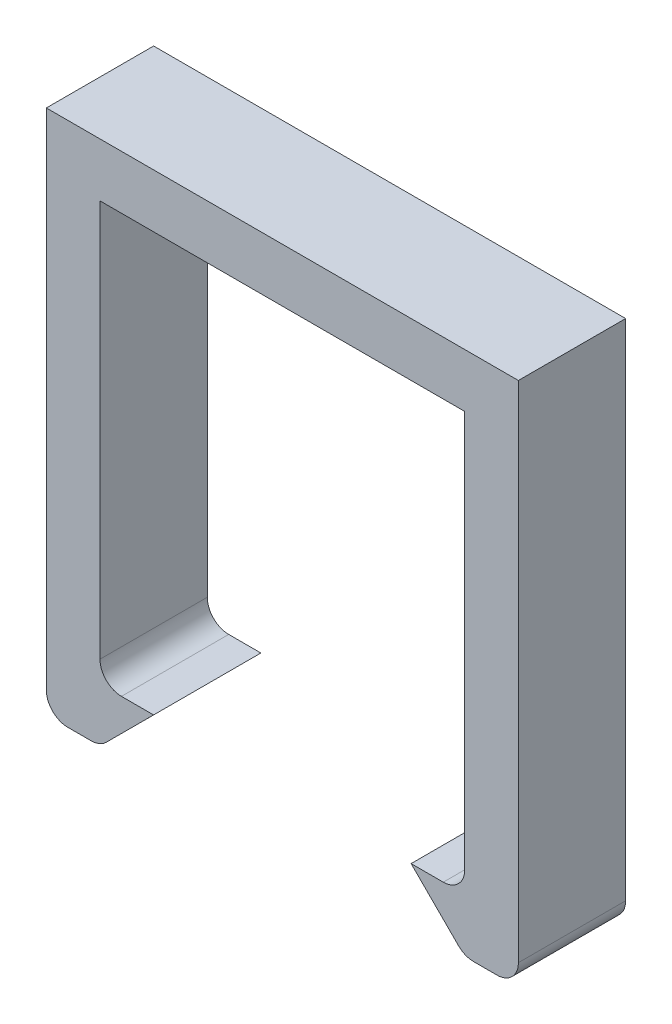
ISO-10303-21;
HEADER;
FILE_DESCRIPTION(('STEP AP214'),'2;1');
FILE_NAME('part.step','',(''),(''),'','','');
FILE_SCHEMA(('AUTOMOTIVE_DESIGN { 1 0 10303 214 1 1 1 1 }'));
ENDSEC;
DATA;
#1=APPLICATION_CONTEXT('core data for automotive mechanical design processes');
#2=APPLICATION_PROTOCOL_DEFINITION('international standard','automotive_design',2000,#1);
#3=PRODUCT_CONTEXT('',#1,'mechanical');
#4=PRODUCT('Part','Part','',(#3));
#5=PRODUCT_RELATED_PRODUCT_CATEGORY('part','',(#4));
#6=PRODUCT_DEFINITION_FORMATION('','',#4);
#7=PRODUCT_DEFINITION_CONTEXT('part definition',#1,'design');
#8=PRODUCT_DEFINITION('design','',#6,#7);
#9=PRODUCT_DEFINITION_SHAPE('','',#8);
#10=(LENGTH_UNIT() NAMED_UNIT(*) SI_UNIT(.MILLI.,.METRE.));
#11=(NAMED_UNIT(*) PLANE_ANGLE_UNIT() SI_UNIT($,.RADIAN.));
#12=(NAMED_UNIT(*) SI_UNIT($,.STERADIAN.) SOLID_ANGLE_UNIT());
#13=UNCERTAINTY_MEASURE_WITH_UNIT(LENGTH_MEASURE(1.E-05),#10,'distance_accuracy_value','');
#14=(GEOMETRIC_REPRESENTATION_CONTEXT(3) GLOBAL_UNCERTAINTY_ASSIGNED_CONTEXT((#13)) GLOBAL_UNIT_ASSIGNED_CONTEXT((#10,
#11,#12)) REPRESENTATION_CONTEXT('',''));
#15=CARTESIAN_POINT('',(0.,0.,0.));
#16=DIRECTION('',(0.,0.,1.));
#17=DIRECTION('',(1.,0.,0.));
#18=AXIS2_PLACEMENT_3D('',#15,#16,#17);
#19=CARTESIAN_POINT('',(-6.34974871916733,-59.689999999435,12.7));
#20=DIRECTION('',(-1.,0.,0.));
#21=DIRECTION('',(0.,-1.,0.));
#22=AXIS2_PLACEMENT_3D('',#19,#20,#21);
#23=PLANE('',#22);
#24=DIRECTION('',(0.,1.,0.));
#25=VECTOR('',#24,1.);
#26=CARTESIAN_POINT('',(-6.34974871916733,-59.689999999435,0.));
#27=LINE('',#26,#25);
#28=CARTESIAN_POINT('',(-6.34974871916734,-59.689999999435,0.));
#29=VERTEX_POINT('',#28);
#30=CARTESIAN_POINT('',(-6.34974871916733,0.,0.));
#31=VERTEX_POINT('',#30);
#32=EDGE_CURVE('E270',#29,#31,#27,.T.);
#33=ORIENTED_EDGE('',*,*,#32,.F.);
#34=DIRECTION('',(0.,0.,-1.));
#35=VECTOR('',#34,1.);
#36=CARTESIAN_POINT('',(-6.34974871916734,-59.689999999435,12.7));
#37=LINE('',#36,#35);
#38=CARTESIAN_POINT('',(-6.34974871916734,-59.689999999435,12.7));
#39=VERTEX_POINT('',#38);
#40=EDGE_CURVE('E57',#39,#29,#37,.T.);
#41=ORIENTED_EDGE('',*,*,#40,.F.);
#42=DIRECTION('',(0.,1.,0.));
#43=VECTOR('',#42,1.);
#44=CARTESIAN_POINT('',(-6.34974871916733,-59.689999999435,12.7));
#45=LINE('',#44,#43);
#46=CARTESIAN_POINT('',(-6.34974871916733,0.,12.7));
#47=VERTEX_POINT('',#46);
#48=EDGE_CURVE('E195',#39,#47,#45,.T.);
#49=ORIENTED_EDGE('',*,*,#48,.T.);
#50=DIRECTION('',(0.,0.,-1.));
#51=VECTOR('',#50,1.);
#52=CARTESIAN_POINT('',(-6.34974871916733,0.,12.7));
#53=LINE('',#52,#51);
#54=EDGE_CURVE('E11',#47,#31,#53,.T.);
#55=ORIENTED_EDGE('',*,*,#54,.T.);
#56=EDGE_LOOP('',(#33,#41,#49,#55));
#57=FACE_BOUND('',#56,.T.);
#58=ADVANCED_FACE('F44',(#57),#23,.T.);
#59=CARTESIAN_POINT('',(-3.80974871916733,-59.689999999435,12.7));
#60=DIRECTION('',(0.,0.,-1.));
#61=DIRECTION('',(-1.,0.,0.));
#62=AXIS2_PLACEMENT_3D('',#59,#60,#61);
#63=CYLINDRICAL_SURFACE('',#62,2.54);
#64=CARTESIAN_POINT('',(-3.80974871916733,-59.689999999435,0.));
#65=DIRECTION('',(0.,0.,-1.));
#66=DIRECTION('',(-1.,0.,0.));
#67=AXIS2_PLACEMENT_3D('',#64,#65,#66);
#68=CIRCLE('',#67,2.54);
#69=CARTESIAN_POINT('',(-3.80974871916733,-62.229999999435,0.));
#70=VERTEX_POINT('',#69);
#71=EDGE_CURVE('E180',#70,#29,#68,.T.);
#72=ORIENTED_EDGE('',*,*,#71,.F.);
#73=DIRECTION('',(0.,0.,-1.));
#74=VECTOR('',#73,1.);
#75=CARTESIAN_POINT('',(-3.80974871916733,-62.229999999435,12.7));
#76=LINE('',#75,#74);
#77=CARTESIAN_POINT('',(-3.80974871916733,-62.229999999435,12.7));
#78=VERTEX_POINT('',#77);
#79=EDGE_CURVE('E175',#78,#70,#76,.T.);
#80=ORIENTED_EDGE('',*,*,#79,.F.);
#81=CARTESIAN_POINT('',(-3.80974871916733,-59.689999999435,12.7));
#82=DIRECTION('',(0.,0.,-1.));
#83=DIRECTION('',(-1.,0.,0.));
#84=AXIS2_PLACEMENT_3D('',#81,#82,#83);
#85=CIRCLE('',#84,2.54);
#86=EDGE_CURVE('E173',#78,#39,#85,.T.);
#87=ORIENTED_EDGE('',*,*,#86,.T.);
#88=ORIENTED_EDGE('',*,*,#40,.T.);
#89=EDGE_LOOP('',(#72,#80,#87,#88));
#90=FACE_BOUND('',#89,.T.);
#91=ADVANCED_FACE('F171',(#90),#63,.T.);
#92=CARTESIAN_POINT('',(-1.05188060767889,-62.229999999435,12.7));
#93=DIRECTION('',(0.,-1.,0.));
#94=DIRECTION('',(0.,0.,-1.));
#95=AXIS2_PLACEMENT_3D('',#92,#93,#94);
#96=PLANE('',#95);
#97=DIRECTION('',(-1.,0.,0.));
#98=VECTOR('',#97,1.);
#99=CARTESIAN_POINT('',(-1.05188060767889,-62.229999999435,0.));
#100=LINE('',#99,#98);
#101=CARTESIAN_POINT('',(-1.05188060767889,-62.229999999435,0.));
#102=VERTEX_POINT('',#101);
#103=EDGE_CURVE('E265',#102,#70,#100,.T.);
#104=ORIENTED_EDGE('',*,*,#103,.F.);
#105=DIRECTION('',(0.,0.,-1.));
#106=VECTOR('',#105,1.);
#107=CARTESIAN_POINT('',(-1.05188060767889,-62.229999999435,12.7));
#108=LINE('',#107,#106);
#109=CARTESIAN_POINT('',(-1.05188060767889,-62.229999999435,12.7));
#110=VERTEX_POINT('',#109);
#111=EDGE_CURVE('E181',#110,#102,#108,.T.);
#112=ORIENTED_EDGE('',*,*,#111,.F.);
#113=DIRECTION('',(-1.,0.,0.));
#114=VECTOR('',#113,1.);
#115=CARTESIAN_POINT('',(-1.05188060767889,-62.229999999435,12.7));
#116=LINE('',#115,#114);
#117=EDGE_CURVE('E186',#110,#78,#116,.T.);
#118=ORIENTED_EDGE('',*,*,#117,.T.);
#119=ORIENTED_EDGE('',*,*,#79,.T.);
#120=EDGE_LOOP('',(#104,#112,#118,#119));
#121=FACE_BOUND('',#120,.T.);
#122=ADVANCED_FACE('F194',(#121),#96,.T.);
#123=CARTESIAN_POINT('',(-1.05188060767889,-59.689999999435,12.7));
#124=DIRECTION('',(0.,0.,-1.));
#125=DIRECTION('',(-1.,0.,0.));
#126=AXIS2_PLACEMENT_3D('',#123,#124,#125);
#127=CYLINDRICAL_SURFACE('',#126,2.54);
#128=CARTESIAN_POINT('',(-1.05188060767889,-59.689999999435,0.));
#129=DIRECTION('',(0.,0.,-1.));
#130=DIRECTION('',(-1.,0.,0.));
#131=AXIS2_PLACEMENT_3D('',#128,#129,#130);
#132=CIRCLE('',#131,2.54);
#133=CARTESIAN_POINT('',(0.744206153362641,-61.486015686118,0.));
#134=VERTEX_POINT('',#133);
#135=EDGE_CURVE('E256',#134,#102,#132,.T.);
#136=ORIENTED_EDGE('',*,*,#135,.F.);
#137=DIRECTION('',(0.,0.,-1.));
#138=VECTOR('',#137,1.);
#139=CARTESIAN_POINT('',(0.744206153362641,-61.486015686118,12.7));
#140=LINE('',#139,#138);
#141=CARTESIAN_POINT('',(0.744206153362641,-61.486015686118,12.7));
#142=VERTEX_POINT('',#141);
#143=EDGE_CURVE('E274',#142,#134,#140,.T.);
#144=ORIENTED_EDGE('',*,*,#143,.F.);
#145=CARTESIAN_POINT('',(-1.05188060767889,-59.689999999435,12.7));
#146=DIRECTION('',(0.,0.,-1.));
#147=DIRECTION('',(-1.,0.,0.));
#148=AXIS2_PLACEMENT_3D('',#145,#146,#147);
#149=CIRCLE('',#148,2.54);
#150=EDGE_CURVE('E197',#142,#110,#149,.T.);
#151=ORIENTED_EDGE('',*,*,#150,.T.);
#152=ORIENTED_EDGE('',*,*,#111,.T.);
#153=EDGE_LOOP('',(#136,#144,#151,#152));
#154=FACE_BOUND('',#153,.T.);
#155=ADVANCED_FACE('F337',(#154),#127,.T.);
#156=CARTESIAN_POINT('',(0.744206153362641,-61.486015686118,12.7));
#157=DIRECTION('',(-0.707120772063596,0.707092790032668,0.));
#158=DIRECTION('',(-0.707092790032668,-0.707120772063597,0.));
#159=AXIS2_PLACEMENT_3D('',#156,#157,#158);
#160=PLANE('',#159);
#161=DIRECTION('',(0.707092790032668,0.707120772063597,0.));
#162=VECTOR('',#161,1.);
#163=CARTESIAN_POINT('',(0.744206153362641,-61.486015686118,0.));
#164=LINE('',#163,#162);
#165=CARTESIAN_POINT('',(6.35000000000001,-55.879999999435,0.));
#166=VERTEX_POINT('',#165);
#167=EDGE_CURVE('E254',#134,#166,#164,.T.);
#168=ORIENTED_EDGE('',*,*,#167,.T.);
#169=DIRECTION('',(0.,0.,-1.));
#170=VECTOR('',#169,1.);
#171=CARTESIAN_POINT('',(6.35000000000001,-55.879999999435,12.7));
#172=LINE('',#171,#170);
#173=CARTESIAN_POINT('',(6.35000000000001,-55.879999999435,12.7));
#174=VERTEX_POINT('',#173);
#175=EDGE_CURVE('E279',#174,#166,#172,.T.);
#176=ORIENTED_EDGE('',*,*,#175,.F.);
#177=DIRECTION('',(0.707092790032668,0.707120772063597,0.));
#178=VECTOR('',#177,1.);
#179=CARTESIAN_POINT('',(0.744206153362641,-61.486015686118,12.7));
#180=LINE('',#179,#178);
#181=EDGE_CURVE('E199',#142,#174,#180,.T.);
#182=ORIENTED_EDGE('',*,*,#181,.F.);
#183=ORIENTED_EDGE('',*,*,#143,.T.);
#184=EDGE_LOOP('',(#168,#176,#182,#183));
#185=FACE_BOUND('',#184,.T.);
#186=ADVANCED_FACE('F336',(#185),#160,.F.);
#187=CARTESIAN_POINT('',(6.35000000000001,-55.879999999435,12.7));
#188=DIRECTION('',(0.,-1.,0.));
#189=DIRECTION('',(0.,0.,-1.));
#190=AXIS2_PLACEMENT_3D('',#187,#188,#189);
#191=PLANE('',#190);
#192=DIRECTION('',(-1.,0.,0.));
#193=VECTOR('',#192,1.);
#194=CARTESIAN_POINT('',(6.35000000000001,-55.879999999435,0.));
#195=LINE('',#194,#193);
#196=CARTESIAN_POINT('',(2.54000000000001,-55.879999999435,0.));
#197=VERTEX_POINT('',#196);
#198=EDGE_CURVE('E252',#166,#197,#195,.T.);
#199=ORIENTED_EDGE('',*,*,#198,.T.);
#200=DIRECTION('',(0.,0.,-1.));
#201=VECTOR('',#200,1.);
#202=CARTESIAN_POINT('',(2.54000000000001,-55.879999999435,12.7));
#203=LINE('',#202,#201);
#204=CARTESIAN_POINT('',(2.54000000000001,-55.879999999435,12.7));
#205=VERTEX_POINT('',#204);
#206=EDGE_CURVE('E285',#205,#197,#203,.T.);
#207=ORIENTED_EDGE('',*,*,#206,.F.);
#208=DIRECTION('',(-1.,0.,0.));
#209=VECTOR('',#208,1.);
#210=CARTESIAN_POINT('',(6.35000000000001,-55.879999999435,12.7));
#211=LINE('',#210,#209);
#212=EDGE_CURVE('E551',#174,#205,#211,.T.);
#213=ORIENTED_EDGE('',*,*,#212,.F.);
#214=ORIENTED_EDGE('',*,*,#175,.T.);
#215=EDGE_LOOP('',(#199,#207,#213,#214));
#216=FACE_BOUND('',#215,.T.);
#217=ADVANCED_FACE('F342',(#216),#191,.F.);
#218=CARTESIAN_POINT('',(2.54000000000001,-53.339999999435,12.7));
#219=DIRECTION('',(0.,0.,-1.));
#220=DIRECTION('',(-1.,0.,0.));
#221=AXIS2_PLACEMENT_3D('',#218,#219,#220);
#222=CYLINDRICAL_SURFACE('',#221,2.54);
#223=CARTESIAN_POINT('',(2.54000000000001,-53.339999999435,0.));
#224=DIRECTION('',(0.,0.,-1.));
#225=DIRECTION('',(-1.,0.,0.));
#226=AXIS2_PLACEMENT_3D('',#223,#224,#225);
#227=CIRCLE('',#226,2.54);
#228=CARTESIAN_POINT('',(0.,-53.339999999435,0.));
#229=VERTEX_POINT('',#228);
#230=EDGE_CURVE('E247',#197,#229,#227,.T.);
#231=ORIENTED_EDGE('',*,*,#230,.T.);
#232=DIRECTION('',(0.,0.,-1.));
#233=VECTOR('',#232,1.);
#234=CARTESIAN_POINT('',(0.,-53.339999999435,12.7));
#235=LINE('',#234,#233);
#236=CARTESIAN_POINT('',(0.,-53.339999999435,12.7));
#237=VERTEX_POINT('',#236);
#238=EDGE_CURVE('E286',#237,#229,#235,.T.);
#239=ORIENTED_EDGE('',*,*,#238,.F.);
#240=CARTESIAN_POINT('',(2.54000000000001,-53.339999999435,12.7));
#241=DIRECTION('',(0.,0.,-1.));
#242=DIRECTION('',(-1.,0.,0.));
#243=AXIS2_PLACEMENT_3D('',#240,#241,#242);
#244=CIRCLE('',#243,2.54);
#245=EDGE_CURVE('E559',#205,#237,#244,.T.);
#246=ORIENTED_EDGE('',*,*,#245,.F.);
#247=ORIENTED_EDGE('',*,*,#206,.T.);
#248=EDGE_LOOP('',(#231,#239,#246,#247));
#249=FACE_BOUND('',#248,.T.);
#250=ADVANCED_FACE('F350',(#249),#222,.F.);
#251=CARTESIAN_POINT('',(0.,-6.35000000000001,12.7));
#252=DIRECTION('',(1.,0.,0.));
#253=DIRECTION('',(0.,1.,0.));
#254=AXIS2_PLACEMENT_3D('',#251,#252,#253);
#255=PLANE('',#254);
#256=DIRECTION('',(0.,-1.,0.));
#257=VECTOR('',#256,1.);
#258=CARTESIAN_POINT('',(0.,-6.35000000000001,0.));
#259=LINE('',#258,#257);
#260=CARTESIAN_POINT('',(0.,-6.35000000000001,0.));
#261=VERTEX_POINT('',#260);
#262=EDGE_CURVE('E241',#261,#229,#259,.T.);
#263=ORIENTED_EDGE('',*,*,#262,.F.);
#264=DIRECTION('',(0.,0.,-1.));
#265=VECTOR('',#264,1.);
#266=CARTESIAN_POINT('',(0.,-6.35000000000001,12.7));
#267=LINE('',#266,#265);
#268=CARTESIAN_POINT('',(0.,-6.35000000000001,12.7));
#269=VERTEX_POINT('',#268);
#270=EDGE_CURVE('E288',#269,#261,#267,.T.);
#271=ORIENTED_EDGE('',*,*,#270,.F.);
#272=DIRECTION('',(0.,-1.,0.));
#273=VECTOR('',#272,1.);
#274=CARTESIAN_POINT('',(0.,-6.35000000000001,12.7));
#275=LINE('',#274,#273);
#276=EDGE_CURVE('E546',#269,#237,#275,.T.);
#277=ORIENTED_EDGE('',*,*,#276,.T.);
#278=ORIENTED_EDGE('',*,*,#238,.T.);
#279=EDGE_LOOP('',(#263,#271,#277,#278));
#280=FACE_BOUND('',#279,.T.);
#281=ADVANCED_FACE('F352',(#280),#255,.T.);
#282=CARTESIAN_POINT('',(43.1805025616653,-6.35,12.7));
#283=DIRECTION('',(0.,-1.,0.));
#284=DIRECTION('',(1.,0.,0.));
#285=AXIS2_PLACEMENT_3D('',#282,#283,#284);
#286=PLANE('',#285);
#287=DIRECTION('',(-1.,0.,0.));
#288=VECTOR('',#287,1.);
#289=CARTESIAN_POINT('',(43.1805025616653,-6.35,0.));
#290=LINE('',#289,#288);
#291=CARTESIAN_POINT('',(43.1805025616653,-6.35,0.));
#292=VERTEX_POINT('',#291);
#293=EDGE_CURVE('E238',#292,#261,#290,.T.);
#294=ORIENTED_EDGE('',*,*,#293,.F.);
#295=DIRECTION('',(0.,0.,-1.));
#296=VECTOR('',#295,1.);
#297=CARTESIAN_POINT('',(43.1805025616653,-6.35,12.7));
#298=LINE('',#297,#296);
#299=CARTESIAN_POINT('',(43.1805025616653,-6.35,12.7));
#300=VERTEX_POINT('',#299);
#301=EDGE_CURVE('E295',#300,#292,#298,.T.);
#302=ORIENTED_EDGE('',*,*,#301,.F.);
#303=DIRECTION('',(-1.,0.,0.));
#304=VECTOR('',#303,1.);
#305=CARTESIAN_POINT('',(43.1805025616653,-6.35,12.7));
#306=LINE('',#305,#304);
#307=EDGE_CURVE('E545',#300,#269,#306,.T.);
#308=ORIENTED_EDGE('',*,*,#307,.T.);
#309=ORIENTED_EDGE('',*,*,#270,.T.);
#310=EDGE_LOOP('',(#294,#302,#308,#309));
#311=FACE_BOUND('',#310,.T.);
#312=ADVANCED_FACE('F353',(#311),#286,.T.);
#313=CARTESIAN_POINT('',(43.1805025616653,-53.339999999435,12.7));
#314=DIRECTION('',(-1.,0.,0.));
#315=DIRECTION('',(0.,-1.,0.));
#316=AXIS2_PLACEMENT_3D('',#313,#314,#315);
#317=PLANE('',#316);
#318=DIRECTION('',(0.,1.,0.));
#319=VECTOR('',#318,1.);
#320=CARTESIAN_POINT('',(43.1805025616653,-53.339999999435,0.));
#321=LINE('',#320,#319);
#322=CARTESIAN_POINT('',(43.1805025616653,-53.339999999435,0.));
#323=VERTEX_POINT('',#322);
#324=EDGE_CURVE('E237',#323,#292,#321,.T.);
#325=ORIENTED_EDGE('',*,*,#324,.F.);
#326=DIRECTION('',(0.,0.,-1.));
#327=VECTOR('',#326,1.);
#328=CARTESIAN_POINT('',(43.1805025616653,-53.339999999435,12.7));
#329=LINE('',#328,#327);
#330=CARTESIAN_POINT('',(43.1805025616653,-53.339999999435,12.7));
#331=VERTEX_POINT('',#330);
#332=EDGE_CURVE('E293',#331,#323,#329,.T.);
#333=ORIENTED_EDGE('',*,*,#332,.F.);
#334=DIRECTION('',(0.,1.,0.));
#335=VECTOR('',#334,1.);
#336=CARTESIAN_POINT('',(43.1805025616653,-53.339999999435,12.7));
#337=LINE('',#336,#335);
#338=EDGE_CURVE('E536',#331,#300,#337,.T.);
#339=ORIENTED_EDGE('',*,*,#338,.T.);
#340=ORIENTED_EDGE('',*,*,#301,.T.);
#341=EDGE_LOOP('',(#325,#333,#339,#340));
#342=FACE_BOUND('',#341,.T.);
#343=ADVANCED_FACE('F358',(#342),#317,.T.);
#344=CARTESIAN_POINT('',(40.6405025616653,-53.339999999435,12.7));
#345=DIRECTION('',(0.,0.,-1.));
#346=DIRECTION('',(-1.,0.,0.));
#347=AXIS2_PLACEMENT_3D('',#344,#345,#346);
#348=CYLINDRICAL_SURFACE('',#347,2.54);
#349=CARTESIAN_POINT('',(40.6405025616653,-53.339999999435,0.));
#350=DIRECTION('',(0.,0.,-1.));
#351=DIRECTION('',(-1.,0.,0.));
#352=AXIS2_PLACEMENT_3D('',#349,#350,#351);
#353=CIRCLE('',#352,2.54);
#354=CARTESIAN_POINT('',(40.6405025616653,-55.879999999435,0.));
#355=VERTEX_POINT('',#354);
#356=EDGE_CURVE('E235',#323,#355,#353,.T.);
#357=ORIENTED_EDGE('',*,*,#356,.T.);
#358=DIRECTION('',(0.,0.,-1.));
#359=VECTOR('',#358,1.);
#360=CARTESIAN_POINT('',(40.6405025616653,-55.879999999435,12.7));
#361=LINE('',#360,#359);
#362=CARTESIAN_POINT('',(40.6405025616653,-55.879999999435,12.7));
#363=VERTEX_POINT('',#362);
#364=EDGE_CURVE('E299',#363,#355,#361,.T.);
#365=ORIENTED_EDGE('',*,*,#364,.F.);
#366=CARTESIAN_POINT('',(40.6405025616653,-53.339999999435,12.7));
#367=DIRECTION('',(0.,0.,-1.));
#368=DIRECTION('',(-1.,0.,0.));
#369=AXIS2_PLACEMENT_3D('',#366,#367,#368);
#370=CIRCLE('',#369,2.54);
#371=EDGE_CURVE('E531',#331,#363,#370,.T.);
#372=ORIENTED_EDGE('',*,*,#371,.F.);
#373=ORIENTED_EDGE('',*,*,#332,.T.);
#374=EDGE_LOOP('',(#357,#365,#372,#373));
#375=FACE_BOUND('',#374,.T.);
#376=ADVANCED_FACE('F361',(#375),#348,.F.);
#377=CARTESIAN_POINT('',(36.8305025616653,-55.879999999435,12.7));
#378=DIRECTION('',(0.,1.,0.));
#379=DIRECTION('',(0.,0.,1.));
#380=AXIS2_PLACEMENT_3D('',#377,#378,#379);
#381=PLANE('',#380);
#382=DIRECTION('',(1.,0.,0.));
#383=VECTOR('',#382,1.);
#384=CARTESIAN_POINT('',(36.8305025616653,-55.879999999435,0.));
#385=LINE('',#384,#383);
#386=CARTESIAN_POINT('',(36.8305025616653,-55.879999999435,0.));
#387=VERTEX_POINT('',#386);
#388=EDGE_CURVE('E229',#387,#355,#385,.T.);
#389=ORIENTED_EDGE('',*,*,#388,.F.);
#390=DIRECTION('',(0.,0.,-1.));
#391=VECTOR('',#390,1.);
#392=CARTESIAN_POINT('',(36.8305025616653,-55.879999999435,12.7));
#393=LINE('',#392,#391);
#394=CARTESIAN_POINT('',(36.8305025616653,-55.879999999435,12.7));
#395=VERTEX_POINT('',#394);
#396=EDGE_CURVE('E301',#395,#387,#393,.T.);
#397=ORIENTED_EDGE('',*,*,#396,.F.);
#398=DIRECTION('',(1.,0.,0.));
#399=VECTOR('',#398,1.);
#400=CARTESIAN_POINT('',(36.8305025616653,-55.879999999435,12.7));
#401=LINE('',#400,#399);
#402=EDGE_CURVE('E533',#395,#363,#401,.T.);
#403=ORIENTED_EDGE('',*,*,#402,.T.);
#404=ORIENTED_EDGE('',*,*,#364,.T.);
#405=EDGE_LOOP('',(#389,#397,#403,#404));
#406=FACE_BOUND('',#405,.T.);
#407=ADVANCED_FACE('F370',(#406),#381,.T.);
#408=CARTESIAN_POINT('',(42.4362964083027,-61.486015686118,12.7));
#409=DIRECTION('',(-0.707120772063596,-0.707092790032668,0.));
#410=DIRECTION('',(0.707092790032669,-0.707120772063596,0.));
#411=AXIS2_PLACEMENT_3D('',#408,#409,#410);
#412=PLANE('',#411);
#413=DIRECTION('',(-0.707092790032668,0.707120772063596,0.));
#414=VECTOR('',#413,1.);
#415=CARTESIAN_POINT('',(42.4362964083027,-61.486015686118,0.));
#416=LINE('',#415,#414);
#417=CARTESIAN_POINT('',(42.4362964083027,-61.486015686118,0.));
#418=VERTEX_POINT('',#417);
#419=EDGE_CURVE('E221',#418,#387,#416,.T.);
#420=ORIENTED_EDGE('',*,*,#419,.F.);
#421=DIRECTION('',(0.,0.,-1.));
#422=VECTOR('',#421,1.);
#423=CARTESIAN_POINT('',(42.4362964083027,-61.486015686118,12.7));
#424=LINE('',#423,#422);
#425=CARTESIAN_POINT('',(42.4362964083027,-61.486015686118,12.7));
#426=VERTEX_POINT('',#425);
#427=EDGE_CURVE('E303',#426,#418,#424,.T.);
#428=ORIENTED_EDGE('',*,*,#427,.F.);
#429=DIRECTION('',(-0.707092790032668,0.707120772063596,0.));
#430=VECTOR('',#429,1.);
#431=CARTESIAN_POINT('',(42.4362964083027,-61.486015686118,12.7));
#432=LINE('',#431,#430);
#433=EDGE_CURVE('E574',#426,#395,#432,.T.);
#434=ORIENTED_EDGE('',*,*,#433,.T.);
#435=ORIENTED_EDGE('',*,*,#396,.T.);
#436=EDGE_LOOP('',(#420,#428,#434,#435));
#437=FACE_BOUND('',#436,.T.);
#438=ADVANCED_FACE('F371',(#437),#412,.T.);
#439=CARTESIAN_POINT('',(44.2323831693442,-59.689999999435,12.7));
#440=DIRECTION('',(0.,0.,-1.));
#441=DIRECTION('',(-1.,0.,0.));
#442=AXIS2_PLACEMENT_3D('',#439,#440,#441);
#443=CYLINDRICAL_SURFACE('',#442,2.54);
#444=CARTESIAN_POINT('',(44.2323831693442,-59.689999999435,0.));
#445=DIRECTION('',(0.,0.,-1.));
#446=DIRECTION('',(-1.,0.,0.));
#447=AXIS2_PLACEMENT_3D('',#444,#445,#446);
#448=CIRCLE('',#447,2.54);
#449=CARTESIAN_POINT('',(44.2323831693442,-62.229999999435,0.));
#450=VERTEX_POINT('',#449);
#451=EDGE_CURVE('E219',#450,#418,#448,.T.);
#452=ORIENTED_EDGE('',*,*,#451,.F.);
#453=DIRECTION('',(0.,0.,-1.));
#454=VECTOR('',#453,1.);
#455=CARTESIAN_POINT('',(44.2323831693442,-62.229999999435,12.7));
#456=LINE('',#455,#454);
#457=CARTESIAN_POINT('',(44.2323831693442,-62.229999999435,12.7));
#458=VERTEX_POINT('',#457);
#459=EDGE_CURVE('E307',#458,#450,#456,.T.);
#460=ORIENTED_EDGE('',*,*,#459,.F.);
#461=CARTESIAN_POINT('',(44.2323831693442,-59.689999999435,12.7));
#462=DIRECTION('',(0.,0.,-1.));
#463=DIRECTION('',(-1.,0.,0.));
#464=AXIS2_PLACEMENT_3D('',#461,#462,#463);
#465=CIRCLE('',#464,2.54);
#466=EDGE_CURVE('E525',#458,#426,#465,.T.);
#467=ORIENTED_EDGE('',*,*,#466,.T.);
#468=ORIENTED_EDGE('',*,*,#427,.T.);
#469=EDGE_LOOP('',(#452,#460,#467,#468));
#470=FACE_BOUND('',#469,.T.);
#471=ADVANCED_FACE('F374',(#470),#443,.T.);
#472=CARTESIAN_POINT('',(46.9902512808327,-62.229999999435,12.7));
#473=DIRECTION('',(0.,-1.,0.));
#474=DIRECTION('',(1.,0.,0.));
#475=AXIS2_PLACEMENT_3D('',#472,#473,#474);
#476=PLANE('',#475);
#477=DIRECTION('',(-1.,0.,0.));
#478=VECTOR('',#477,1.);
#479=CARTESIAN_POINT('',(46.9902512808327,-62.229999999435,0.));
#480=LINE('',#479,#478);
#481=CARTESIAN_POINT('',(46.9902512808327,-62.229999999435,0.));
#482=VERTEX_POINT('',#481);
#483=EDGE_CURVE('E216',#482,#450,#480,.T.);
#484=ORIENTED_EDGE('',*,*,#483,.F.);
#485=DIRECTION('',(0.,0.,-1.));
#486=VECTOR('',#485,1.);
#487=CARTESIAN_POINT('',(46.9902512808327,-62.229999999435,12.7));
#488=LINE('',#487,#486);
#489=CARTESIAN_POINT('',(46.9902512808327,-62.229999999435,12.7));
#490=VERTEX_POINT('',#489);
#491=EDGE_CURVE('E309',#490,#482,#488,.T.);
#492=ORIENTED_EDGE('',*,*,#491,.F.);
#493=DIRECTION('',(-1.,0.,0.));
#494=VECTOR('',#493,1.);
#495=CARTESIAN_POINT('',(46.9902512808327,-62.229999999435,12.7));
#496=LINE('',#495,#494);
#497=EDGE_CURVE('E519',#490,#458,#496,.T.);
#498=ORIENTED_EDGE('',*,*,#497,.T.);
#499=ORIENTED_EDGE('',*,*,#459,.T.);
#500=EDGE_LOOP('',(#484,#492,#498,#499));
#501=FACE_BOUND('',#500,.T.);
#502=ADVANCED_FACE('F377',(#501),#476,.T.);
#503=CARTESIAN_POINT('',(46.9902512808327,-59.689999999435,12.7));
#504=DIRECTION('',(0.,0.,-1.));
#505=DIRECTION('',(-1.,0.,0.));
#506=AXIS2_PLACEMENT_3D('',#503,#504,#505);
#507=CYLINDRICAL_SURFACE('',#506,2.54);
#508=CARTESIAN_POINT('',(46.9902512808327,-59.689999999435,0.));
#509=DIRECTION('',(0.,0.,-1.));
#510=DIRECTION('',(-1.,0.,0.));
#511=AXIS2_PLACEMENT_3D('',#508,#509,#510);
#512=CIRCLE('',#511,2.54);
#513=CARTESIAN_POINT('',(49.5302512808327,-59.689999999435,0.));
#514=VERTEX_POINT('',#513);
#515=EDGE_CURVE('E215',#514,#482,#512,.T.);
#516=ORIENTED_EDGE('',*,*,#515,.F.);
#517=DIRECTION('',(0.,0.,-1.));
#518=VECTOR('',#517,1.);
#519=CARTESIAN_POINT('',(49.5302512808327,-59.689999999435,12.7));
#520=LINE('',#519,#518);
#521=CARTESIAN_POINT('',(49.5302512808327,-59.689999999435,12.7));
#522=VERTEX_POINT('',#521);
#523=EDGE_CURVE('E315',#522,#514,#520,.T.);
#524=ORIENTED_EDGE('',*,*,#523,.F.);
#525=CARTESIAN_POINT('',(46.9902512808327,-59.689999999435,12.7));
#526=DIRECTION('',(0.,0.,-1.));
#527=DIRECTION('',(-1.,0.,0.));
#528=AXIS2_PLACEMENT_3D('',#525,#526,#527);
#529=CIRCLE('',#528,2.54);
#530=EDGE_CURVE('E579',#522,#490,#529,.T.);
#531=ORIENTED_EDGE('',*,*,#530,.T.);
#532=ORIENTED_EDGE('',*,*,#491,.T.);
#533=EDGE_LOOP('',(#516,#524,#531,#532));
#534=FACE_BOUND('',#533,.T.);
#535=ADVANCED_FACE('F382',(#534),#507,.T.);
#536=CARTESIAN_POINT('',(49.5302512808327,0.,12.7));
#537=DIRECTION('',(1.,0.,0.));
#538=DIRECTION('',(0.,1.,0.));
#539=AXIS2_PLACEMENT_3D('',#536,#537,#538);
#540=PLANE('',#539);
#541=DIRECTION('',(0.,-1.,0.));
#542=VECTOR('',#541,1.);
#543=CARTESIAN_POINT('',(49.5302512808327,0.,0.));
#544=LINE('',#543,#542);
#545=CARTESIAN_POINT('',(49.5302512808327,0.,0.));
#546=VERTEX_POINT('',#545);
#547=EDGE_CURVE('E208',#546,#514,#544,.T.);
#548=ORIENTED_EDGE('',*,*,#547,.F.);
#549=DIRECTION('',(0.,0.,-1.));
#550=VECTOR('',#549,1.);
#551=CARTESIAN_POINT('',(49.5302512808327,0.,12.7));
#552=LINE('',#551,#550);
#553=CARTESIAN_POINT('',(49.5302512808327,0.,12.7));
#554=VERTEX_POINT('',#553);
#555=EDGE_CURVE('E47',#554,#546,#552,.T.);
#556=ORIENTED_EDGE('',*,*,#555,.F.);
#557=DIRECTION('',(0.,-1.,0.));
#558=VECTOR('',#557,1.);
#559=CARTESIAN_POINT('',(49.5302512808327,0.,12.7));
#560=LINE('',#559,#558);
#561=EDGE_CURVE('E581',#554,#522,#560,.T.);
#562=ORIENTED_EDGE('',*,*,#561,.T.);
#563=ORIENTED_EDGE('',*,*,#523,.T.);
#564=EDGE_LOOP('',(#548,#556,#562,#563));
#565=FACE_BOUND('',#564,.T.);
#566=ADVANCED_FACE('F319',(#565),#540,.T.);
#567=CARTESIAN_POINT('',(0.,0.,12.7));
#568=DIRECTION('',(0.,1.,0.));
#569=DIRECTION('',(0.,0.,1.));
#570=AXIS2_PLACEMENT_3D('',#567,#568,#569);
#571=PLANE('',#570);
#572=DIRECTION('',(1.,0.,0.));
#573=VECTOR('',#572,1.);
#574=CARTESIAN_POINT('',(0.,0.,0.));
#575=LINE('',#574,#573);
#576=EDGE_CURVE('E124',#31,#546,#575,.T.);
#577=ORIENTED_EDGE('',*,*,#576,.F.);
#578=ORIENTED_EDGE('',*,*,#54,.F.);
#579=DIRECTION('',(1.,0.,0.));
#580=VECTOR('',#579,1.);
#581=CARTESIAN_POINT('',(-6.34974871916733,0.,12.7));
#582=LINE('',#581,#580);
#583=EDGE_CURVE('E126',#47,#554,#582,.T.);
#584=ORIENTED_EDGE('',*,*,#583,.T.);
#585=ORIENTED_EDGE('',*,*,#555,.T.);
#586=EDGE_LOOP('',(#577,#578,#584,#585));
#587=FACE_BOUND('',#586,.T.);
#588=ADVANCED_FACE('F50',(#587),#571,.T.);
#589=CARTESIAN_POINT('',(46.9902512808327,-59.689999999435,12.7));
#590=DIRECTION('',(0.,0.,-1.));
#591=DIRECTION('',(-1.,0.,0.));
#592=AXIS2_PLACEMENT_3D('',#589,#590,#591);
#593=PLANE('',#592);
#594=ORIENTED_EDGE('',*,*,#583,.F.);
#595=ORIENTED_EDGE('',*,*,#48,.F.);
#596=ORIENTED_EDGE('',*,*,#86,.F.);
#597=ORIENTED_EDGE('',*,*,#117,.F.);
#598=ORIENTED_EDGE('',*,*,#150,.F.);
#599=ORIENTED_EDGE('',*,*,#181,.T.);
#600=ORIENTED_EDGE('',*,*,#212,.T.);
#601=ORIENTED_EDGE('',*,*,#245,.T.);
#602=ORIENTED_EDGE('',*,*,#276,.F.);
#603=ORIENTED_EDGE('',*,*,#307,.F.);
#604=ORIENTED_EDGE('',*,*,#338,.F.);
#605=ORIENTED_EDGE('',*,*,#371,.T.);
#606=ORIENTED_EDGE('',*,*,#402,.F.);
#607=ORIENTED_EDGE('',*,*,#433,.F.);
#608=ORIENTED_EDGE('',*,*,#466,.F.);
#609=ORIENTED_EDGE('',*,*,#497,.F.);
#610=ORIENTED_EDGE('',*,*,#530,.F.);
#611=ORIENTED_EDGE('',*,*,#561,.F.);
#612=EDGE_LOOP('',(#594,#595,#596,#597,#598,#599,#600,#601,#602,#603,#604,#605,#606,#607,#608,
#609,#610,#611));
#613=FACE_BOUND('',#612,.T.);
#614=ADVANCED_FACE('F190',(#613),#593,.F.);
#615=CARTESIAN_POINT('',(46.9902512808327,-59.689999999435,0.));
#616=DIRECTION('',(0.,0.,-1.));
#617=DIRECTION('',(-1.,0.,0.));
#618=AXIS2_PLACEMENT_3D('',#615,#616,#617);
#619=PLANE('',#618);
#620=ORIENTED_EDGE('',*,*,#32,.T.);
#621=ORIENTED_EDGE('',*,*,#576,.T.);
#622=ORIENTED_EDGE('',*,*,#547,.T.);
#623=ORIENTED_EDGE('',*,*,#515,.T.);
#624=ORIENTED_EDGE('',*,*,#483,.T.);
#625=ORIENTED_EDGE('',*,*,#451,.T.);
#626=ORIENTED_EDGE('',*,*,#419,.T.);
#627=ORIENTED_EDGE('',*,*,#388,.T.);
#628=ORIENTED_EDGE('',*,*,#356,.F.);
#629=ORIENTED_EDGE('',*,*,#324,.T.);
#630=ORIENTED_EDGE('',*,*,#293,.T.);
#631=ORIENTED_EDGE('',*,*,#262,.T.);
#632=ORIENTED_EDGE('',*,*,#230,.F.);
#633=ORIENTED_EDGE('',*,*,#198,.F.);
#634=ORIENTED_EDGE('',*,*,#167,.F.);
#635=ORIENTED_EDGE('',*,*,#135,.T.);
#636=ORIENTED_EDGE('',*,*,#103,.T.);
#637=ORIENTED_EDGE('',*,*,#71,.T.);
#638=EDGE_LOOP('',(#620,#621,#622,#623,#624,#625,#626,#627,#628,#629,#630,#631,#632,#633,#634,
#635,#636,#637));
#639=FACE_BOUND('',#638,.T.);
#640=ADVANCED_FACE('F325',(#639),#619,.T.);
#641=CLOSED_SHELL('',(#58,#91,#122,#155,#186,#217,#250,#281,#312,#343,#376,#407,#438,#471,#502,
#535,#566,#588,#614,#640));
#642=MANIFOLD_SOLID_BREP('B2',#641);
#643=ADVANCED_BREP_SHAPE_REPRESENTATION('',(#18,#642),#14);
#644=SHAPE_DEFINITION_REPRESENTATION(#9,#643);
ENDSEC;
END-ISO-10303-21;
